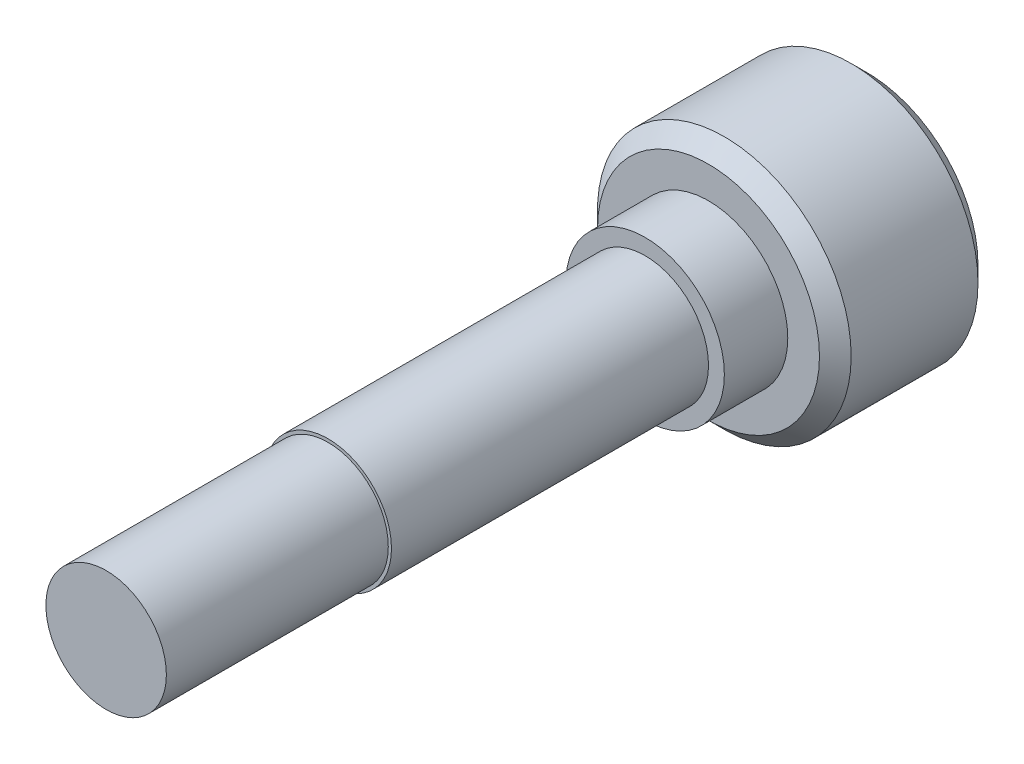
ISO-10303-21;
HEADER;
FILE_DESCRIPTION(('STEP AP214'),'2;1');
FILE_NAME('part.step','',(''),(''),'','','');
FILE_SCHEMA(('AUTOMOTIVE_DESIGN { 1 0 10303 214 1 1 1 1 }'));
ENDSEC;
DATA;
#1=APPLICATION_CONTEXT('core data for automotive mechanical design processes');
#2=APPLICATION_PROTOCOL_DEFINITION('international standard','automotive_design',2000,#1);
#3=PRODUCT_CONTEXT('',#1,'mechanical');
#4=PRODUCT('Part','Part','',(#3));
#5=PRODUCT_RELATED_PRODUCT_CATEGORY('part','',(#4));
#6=PRODUCT_DEFINITION_FORMATION('','',#4);
#7=PRODUCT_DEFINITION_CONTEXT('part definition',#1,'design');
#8=PRODUCT_DEFINITION('design','',#6,#7);
#9=PRODUCT_DEFINITION_SHAPE('','',#8);
#10=(LENGTH_UNIT() NAMED_UNIT(*) SI_UNIT(.MILLI.,.METRE.));
#11=(NAMED_UNIT(*) PLANE_ANGLE_UNIT() SI_UNIT($,.RADIAN.));
#12=(NAMED_UNIT(*) SI_UNIT($,.STERADIAN.) SOLID_ANGLE_UNIT());
#13=UNCERTAINTY_MEASURE_WITH_UNIT(LENGTH_MEASURE(1.E-05),#10,'distance_accuracy_value','');
#14=(GEOMETRIC_REPRESENTATION_CONTEXT(3) GLOBAL_UNCERTAINTY_ASSIGNED_CONTEXT((#13)) GLOBAL_UNIT_ASSIGNED_CONTEXT((#10,
#11,#12)) REPRESENTATION_CONTEXT('',''));
#15=CARTESIAN_POINT('',(0.,0.,0.));
#16=DIRECTION('',(0.,0.,1.));
#17=DIRECTION('',(1.,0.,0.));
#18=AXIS2_PLACEMENT_3D('',#15,#16,#17);
#19=CARTESIAN_POINT('',(0.,0.,24.));
#20=DIRECTION('',(0.,0.,-1.));
#21=DIRECTION('',(-1.,0.,0.));
#22=AXIS2_PLACEMENT_3D('',#19,#20,#21);
#23=CYLINDRICAL_SURFACE('',#22,2.);
#24=CARTESIAN_POINT('',(0.,0.,7.));
#25=DIRECTION('',(0.,0.,1.));
#26=DIRECTION('',(1.,0.,0.));
#27=AXIS2_PLACEMENT_3D('',#24,#25,#26);
#28=CIRCLE('',#27,2.);
#29=CARTESIAN_POINT('',(2.,0.,7.));
#30=VERTEX_POINT('',#29);
#31=EDGE_CURVE('E57',#30,#30,#28,.T.);
#32=ORIENTED_EDGE('',*,*,#31,.T.);
#33=EDGE_LOOP('',(#32));
#34=FACE_BOUND('',#33,.T.);
#35=CARTESIAN_POINT('',(0.,0.,17.));
#36=DIRECTION('',(0.,0.,1.));
#37=DIRECTION('',(1.,0.,0.));
#38=AXIS2_PLACEMENT_3D('',#35,#36,#37);
#39=CIRCLE('',#38,2.);
#40=CARTESIAN_POINT('',(2.,0.,17.));
#41=VERTEX_POINT('',#40);
#42=EDGE_CURVE('E62',#41,#41,#39,.T.);
#43=ORIENTED_EDGE('',*,*,#42,.F.);
#44=EDGE_LOOP('',(#43));
#45=FACE_BOUND('',#44,.T.);
#46=ADVANCED_FACE('F33',(#34,#45),#23,.T.);
#47=CARTESIAN_POINT('',(0.,0.,7.));
#48=DIRECTION('',(0.,0.,1.));
#49=DIRECTION('',(1.,0.,0.));
#50=AXIS2_PLACEMENT_3D('',#47,#48,#49);
#51=PLANE('',#50);
#52=CARTESIAN_POINT('',(0.,0.,7.));
#53=DIRECTION('',(0.,0.,1.));
#54=DIRECTION('',(1.,0.,0.));
#55=AXIS2_PLACEMENT_3D('',#52,#53,#54);
#56=CIRCLE('',#55,2.5);
#57=CARTESIAN_POINT('',(2.5,0.,7.));
#58=VERTEX_POINT('',#57);
#59=EDGE_CURVE('E53',#58,#58,#56,.T.);
#60=ORIENTED_EDGE('',*,*,#59,.T.);
#61=EDGE_LOOP('',(#60));
#62=FACE_BOUND('',#61,.T.);
#63=ORIENTED_EDGE('',*,*,#31,.F.);
#64=EDGE_LOOP('',(#63));
#65=FACE_BOUND('',#64,.T.);
#66=ADVANCED_FACE('F82',(#62,#65),#51,.T.);
#67=CARTESIAN_POINT('',(0.,0.,5.));
#68=DIRECTION('',(0.,0.,1.));
#69=DIRECTION('',(1.,0.,0.));
#70=AXIS2_PLACEMENT_3D('',#67,#68,#69);
#71=PLANE('',#70);
#72=CARTESIAN_POINT('',(0.,0.,5.));
#73=DIRECTION('',(0.,0.,1.));
#74=DIRECTION('',(1.,0.,0.));
#75=AXIS2_PLACEMENT_3D('',#72,#73,#74);
#76=CIRCLE('',#75,3.5);
#77=CARTESIAN_POINT('',(3.5,0.,5.));
#78=VERTEX_POINT('',#77);
#79=EDGE_CURVE('E40',#78,#78,#76,.T.);
#80=ORIENTED_EDGE('',*,*,#79,.T.);
#81=EDGE_LOOP('',(#80));
#82=FACE_BOUND('',#81,.T.);
#83=CARTESIAN_POINT('',(0.,0.,5.));
#84=DIRECTION('',(0.,0.,1.));
#85=DIRECTION('',(1.,0.,0.));
#86=AXIS2_PLACEMENT_3D('',#83,#84,#85);
#87=CIRCLE('',#86,2.5);
#88=CARTESIAN_POINT('',(2.5,0.,5.));
#89=VERTEX_POINT('',#88);
#90=EDGE_CURVE('E54',#89,#89,#87,.T.);
#91=ORIENTED_EDGE('',*,*,#90,.F.);
#92=EDGE_LOOP('',(#91));
#93=FACE_BOUND('',#92,.T.);
#94=ADVANCED_FACE('F90',(#82,#93),#71,.T.);
#95=CARTESIAN_POINT('',(0.,0.,5.));
#96=DIRECTION('',(0.,0.,-1.));
#97=DIRECTION('',(-1.,0.,0.));
#98=AXIS2_PLACEMENT_3D('',#95,#96,#97);
#99=CYLINDRICAL_SURFACE('',#98,4.);
#100=CARTESIAN_POINT('',(0.,0.,4.5));
#101=DIRECTION('',(0.,0.,1.));
#102=DIRECTION('',(1.,0.,0.));
#103=AXIS2_PLACEMENT_3D('',#100,#101,#102);
#104=CIRCLE('',#103,4.);
#105=CARTESIAN_POINT('',(4.,0.,4.5));
#106=VERTEX_POINT('',#105);
#107=EDGE_CURVE('E10',#106,#106,#104,.F.);
#108=ORIENTED_EDGE('',*,*,#107,.T.);
#109=EDGE_LOOP('',(#108));
#110=FACE_BOUND('',#109,.T.);
#111=CARTESIAN_POINT('',(0.,0.,0.499999999999997));
#112=DIRECTION('',(0.,0.,1.));
#113=DIRECTION('',(1.,0.,0.));
#114=AXIS2_PLACEMENT_3D('',#111,#112,#113);
#115=CIRCLE('',#114,4.);
#116=CARTESIAN_POINT('',(4.,0.,0.499999999999997));
#117=VERTEX_POINT('',#116);
#118=EDGE_CURVE('E48',#117,#117,#115,.T.);
#119=ORIENTED_EDGE('',*,*,#118,.T.);
#120=EDGE_LOOP('',(#119));
#121=FACE_BOUND('',#120,.T.);
#122=ADVANCED_FACE('F104',(#110,#121),#99,.T.);
#123=CARTESIAN_POINT('',(0.,0.,0.));
#124=DIRECTION('',(0.,0.,1.));
#125=DIRECTION('',(1.,0.,0.));
#126=AXIS2_PLACEMENT_3D('',#123,#124,#125);
#127=PLANE('',#126);
#128=CARTESIAN_POINT('',(0.,0.,0.));
#129=DIRECTION('',(0.,0.,1.));
#130=DIRECTION('',(1.,0.,0.));
#131=AXIS2_PLACEMENT_3D('',#128,#129,#130);
#132=CIRCLE('',#131,3.5);
#133=CARTESIAN_POINT('',(3.5,0.,0.));
#134=VERTEX_POINT('',#133);
#135=EDGE_CURVE('E44',#134,#134,#132,.F.);
#136=ORIENTED_EDGE('',*,*,#135,.T.);
#137=EDGE_LOOP('',(#136));
#138=FACE_BOUND('',#137,.T.);
#139=ADVANCED_FACE('F100',(#138),#127,.F.);
#140=CARTESIAN_POINT('',(0.,0.,7.));
#141=DIRECTION('',(0.,0.,-1.));
#142=DIRECTION('',(-1.,0.,0.));
#143=AXIS2_PLACEMENT_3D('',#140,#141,#142);
#144=CYLINDRICAL_SURFACE('',#143,2.5);
#145=ORIENTED_EDGE('',*,*,#59,.F.);
#146=EDGE_LOOP('',(#145));
#147=FACE_BOUND('',#146,.T.);
#148=ORIENTED_EDGE('',*,*,#90,.T.);
#149=EDGE_LOOP('',(#148));
#150=FACE_BOUND('',#149,.T.);
#151=ADVANCED_FACE('F96',(#147,#150),#144,.T.);
#152=CARTESIAN_POINT('',(0.,0.,0.499999999999997));
#153=DIRECTION('',(0.,0.,1.));
#154=DIRECTION('',(1.,0.,0.));
#155=AXIS2_PLACEMENT_3D('',#152,#153,#154);
#156=CONICAL_SURFACE('',#155,4.,0.78539816339745);
#157=ORIENTED_EDGE('',*,*,#135,.F.);
#158=EDGE_LOOP('',(#157));
#159=FACE_BOUND('',#158,.T.);
#160=ORIENTED_EDGE('',*,*,#118,.F.);
#161=EDGE_LOOP('',(#160));
#162=FACE_BOUND('',#161,.T.);
#163=ADVANCED_FACE('F99',(#159,#162),#156,.T.);
#164=CARTESIAN_POINT('',(0.,0.,5.));
#165=DIRECTION('',(0.,0.,-1.));
#166=DIRECTION('',(-1.,0.,0.));
#167=AXIS2_PLACEMENT_3D('',#164,#165,#166);
#168=CONICAL_SURFACE('',#167,3.5,0.785398163397448);
#169=ORIENTED_EDGE('',*,*,#107,.F.);
#170=EDGE_LOOP('',(#169));
#171=FACE_BOUND('',#170,.T.);
#172=ORIENTED_EDGE('',*,*,#79,.F.);
#173=EDGE_LOOP('',(#172));
#174=FACE_BOUND('',#173,.T.);
#175=ADVANCED_FACE('F35',(#171,#174),#168,.T.);
#176=CARTESIAN_POINT('',(0.,0.,17.));
#177=DIRECTION('',(0.,0.,1.));
#178=DIRECTION('',(1.,0.,0.));
#179=AXIS2_PLACEMENT_3D('',#176,#177,#178);
#180=PLANE('',#179);
#181=CARTESIAN_POINT('',(0.,0.,17.));
#182=DIRECTION('',(0.,0.,1.));
#183=DIRECTION('',(1.,0.,0.));
#184=AXIS2_PLACEMENT_3D('',#181,#182,#183);
#185=CIRCLE('',#184,1.9);
#186=CARTESIAN_POINT('',(1.9,0.,17.));
#187=VERTEX_POINT('',#186);
#188=EDGE_CURVE('E65',#187,#187,#185,.T.);
#189=ORIENTED_EDGE('',*,*,#188,.F.);
#190=EDGE_LOOP('',(#189));
#191=FACE_BOUND('',#190,.T.);
#192=ORIENTED_EDGE('',*,*,#42,.T.);
#193=EDGE_LOOP('',(#192));
#194=FACE_BOUND('',#193,.T.);
#195=ADVANCED_FACE('F75',(#191,#194),#180,.T.);
#196=CARTESIAN_POINT('',(0.,0.,17.));
#197=DIRECTION('',(0.,0.,1.));
#198=DIRECTION('',(1.,0.,0.));
#199=AXIS2_PLACEMENT_3D('',#196,#197,#198);
#200=CYLINDRICAL_SURFACE('',#199,1.9);
#201=ORIENTED_EDGE('',*,*,#188,.T.);
#202=EDGE_LOOP('',(#201));
#203=FACE_BOUND('',#202,.T.);
#204=CARTESIAN_POINT('',(0.,0.,24.));
#205=DIRECTION('',(0.,0.,1.));
#206=DIRECTION('',(1.,0.,0.));
#207=AXIS2_PLACEMENT_3D('',#204,#205,#206);
#208=CIRCLE('',#207,1.9);
#209=CARTESIAN_POINT('',(1.9,0.,24.));
#210=VERTEX_POINT('',#209);
#211=EDGE_CURVE('E66',#210,#210,#208,.T.);
#212=ORIENTED_EDGE('',*,*,#211,.F.);
#213=EDGE_LOOP('',(#212));
#214=FACE_BOUND('',#213,.T.);
#215=ADVANCED_FACE('F72',(#203,#214),#200,.T.);
#216=CARTESIAN_POINT('',(0.,0.,24.));
#217=DIRECTION('',(0.,0.,1.));
#218=DIRECTION('',(1.,0.,0.));
#219=AXIS2_PLACEMENT_3D('',#216,#217,#218);
#220=PLANE('',#219);
#221=ORIENTED_EDGE('',*,*,#211,.T.);
#222=EDGE_LOOP('',(#221));
#223=FACE_BOUND('',#222,.T.);
#224=ADVANCED_FACE('F94',(#223),#220,.T.);
#225=CLOSED_SHELL('',(#46,#66,#94,#122,#139,#151,#163,#175,#195,#215,#224));
#226=MANIFOLD_SOLID_BREP('B2',#225);
#227=ADVANCED_BREP_SHAPE_REPRESENTATION('',(#18,#226),#14);
#228=SHAPE_DEFINITION_REPRESENTATION(#9,#227);
ENDSEC;
END-ISO-10303-21;
